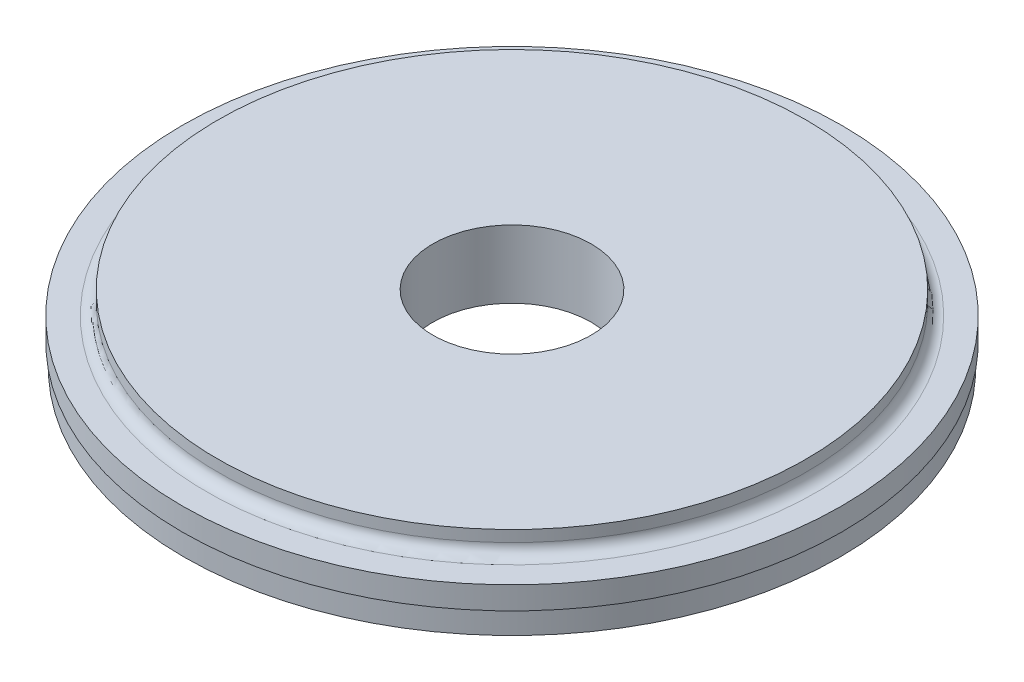
ISO-10303-21;
HEADER;
FILE_DESCRIPTION(('STEP AP214'),'2;1');
FILE_NAME('part.step','',(''),(''),'','','');
FILE_SCHEMA(('AUTOMOTIVE_DESIGN { 1 0 10303 214 1 1 1 1 }'));
ENDSEC;
DATA;
#1=APPLICATION_CONTEXT('core data for automotive mechanical design processes');
#2=APPLICATION_PROTOCOL_DEFINITION('international standard','automotive_design',2000,#1);
#3=PRODUCT_CONTEXT('',#1,'mechanical');
#4=PRODUCT('Part','Part','',(#3));
#5=PRODUCT_RELATED_PRODUCT_CATEGORY('part','',(#4));
#6=PRODUCT_DEFINITION_FORMATION('','',#4);
#7=PRODUCT_DEFINITION_CONTEXT('part definition',#1,'design');
#8=PRODUCT_DEFINITION('design','',#6,#7);
#9=PRODUCT_DEFINITION_SHAPE('','',#8);
#10=(LENGTH_UNIT() NAMED_UNIT(*) SI_UNIT(.MILLI.,.METRE.));
#11=(NAMED_UNIT(*) PLANE_ANGLE_UNIT() SI_UNIT($,.RADIAN.));
#12=(NAMED_UNIT(*) SI_UNIT($,.STERADIAN.) SOLID_ANGLE_UNIT());
#13=UNCERTAINTY_MEASURE_WITH_UNIT(LENGTH_MEASURE(1.E-05),#10,'distance_accuracy_value','');
#14=(GEOMETRIC_REPRESENTATION_CONTEXT(3) GLOBAL_UNCERTAINTY_ASSIGNED_CONTEXT((#13)) GLOBAL_UNIT_ASSIGNED_CONTEXT((#10,
#11,#12)) REPRESENTATION_CONTEXT('',''));
#15=CARTESIAN_POINT('',(0.,0.,0.));
#16=DIRECTION('',(0.,0.,1.));
#17=DIRECTION('',(1.,0.,0.));
#18=AXIS2_PLACEMENT_3D('',#15,#16,#17);
#19=CARTESIAN_POINT('',(0.,15.,65.));
#20=DIRECTION('',(0.,-1.,0.));
#21=DIRECTION('',(0.,0.,-1.));
#22=AXIS2_PLACEMENT_3D('',#19,#20,#21);
#23=PLANE('',#22);
#24=CARTESIAN_POINT('',(0.,15.,0.));
#25=DIRECTION('',(0.,-1.,0.));
#26=DIRECTION('',(0.,0.,-1.));
#27=AXIS2_PLACEMENT_3D('',#24,#25,#26);
#28=CIRCLE('',#27,65.);
#29=CARTESIAN_POINT('',(0.,15.,-65.));
#30=VERTEX_POINT('',#29);
#31=EDGE_CURVE('E10',#30,#30,#28,.T.);
#32=ORIENTED_EDGE('',*,*,#31,.F.);
#33=EDGE_LOOP('',(#32));
#34=FACE_BOUND('',#33,.T.);
#35=CARTESIAN_POINT('',(0.,15.,0.));
#36=DIRECTION('',(0.,-1.,0.));
#37=DIRECTION('',(0.,0.,-1.));
#38=AXIS2_PLACEMENT_3D('',#35,#36,#37);
#39=CIRCLE('',#38,17.5);
#40=CARTESIAN_POINT('',(0.,15.,-17.5));
#41=VERTEX_POINT('',#40);
#42=EDGE_CURVE('E78',#41,#41,#39,.T.);
#43=ORIENTED_EDGE('',*,*,#42,.T.);
#44=EDGE_LOOP('',(#43));
#45=FACE_BOUND('',#44,.T.);
#46=ADVANCED_FACE('F37',(#34,#45),#23,.F.);
#47=CARTESIAN_POINT('',(0.,0.,0.));
#48=DIRECTION('',(0.,-1.,0.));
#49=DIRECTION('',(0.,0.,-1.));
#50=AXIS2_PLACEMENT_3D('',#47,#48,#49);
#51=CYLINDRICAL_SURFACE('',#50,65.);
#52=CARTESIAN_POINT('',(0.,12.5,0.));
#53=DIRECTION('',(0.,-1.,0.));
#54=DIRECTION('',(0.,0.,-1.));
#55=AXIS2_PLACEMENT_3D('',#52,#53,#54);
#56=CIRCLE('',#55,65.);
#57=CARTESIAN_POINT('',(0.,12.5,-65.));
#58=VERTEX_POINT('',#57);
#59=EDGE_CURVE('E44',#58,#58,#56,.T.);
#60=ORIENTED_EDGE('',*,*,#59,.F.);
#61=EDGE_LOOP('',(#60));
#62=FACE_BOUND('',#61,.T.);
#63=ORIENTED_EDGE('',*,*,#31,.T.);
#64=EDGE_LOOP('',(#63));
#65=FACE_BOUND('',#64,.T.);
#66=ADVANCED_FACE('F123',(#62,#65),#51,.T.);
#67=CARTESIAN_POINT('',(0.,12.5,0.));
#68=DIRECTION('',(0.,-1.,0.));
#69=DIRECTION('',(0.,0.,-1.));
#70=AXIS2_PLACEMENT_3D('',#67,#68,#69);
#71=TOROIDAL_SURFACE('',#70,67.5,2.5);
#72=CARTESIAN_POINT('',(0.,9.99999999999999,0.));
#73=DIRECTION('',(0.,-1.,0.));
#74=DIRECTION('',(0.,0.,-1.));
#75=AXIS2_PLACEMENT_3D('',#72,#73,#74);
#76=CIRCLE('',#75,67.5);
#77=CARTESIAN_POINT('',(0.,9.99999999999999,-67.5));
#78=VERTEX_POINT('',#77);
#79=EDGE_CURVE('E50',#78,#78,#76,.T.);
#80=ORIENTED_EDGE('',*,*,#79,.F.);
#81=EDGE_LOOP('',(#80));
#82=FACE_BOUND('',#81,.T.);
#83=ORIENTED_EDGE('',*,*,#59,.T.);
#84=EDGE_LOOP('',(#83));
#85=FACE_BOUND('',#84,.T.);
#86=ADVANCED_FACE('F118',(#82,#85),#71,.F.);
#87=CARTESIAN_POINT('',(0.,9.99999999999999,72.9));
#88=DIRECTION('',(0.,-1.,0.));
#89=DIRECTION('',(0.,0.,-1.));
#90=AXIS2_PLACEMENT_3D('',#87,#88,#89);
#91=PLANE('',#90);
#92=CARTESIAN_POINT('',(0.,9.99999999999999,0.));
#93=DIRECTION('',(0.,-1.,0.));
#94=DIRECTION('',(0.,0.,-1.));
#95=AXIS2_PLACEMENT_3D('',#92,#93,#94);
#96=CIRCLE('',#95,72.9);
#97=CARTESIAN_POINT('',(0.,9.99999999999999,-72.9));
#98=VERTEX_POINT('',#97);
#99=EDGE_CURVE('E56',#98,#98,#96,.T.);
#100=ORIENTED_EDGE('',*,*,#99,.F.);
#101=EDGE_LOOP('',(#100));
#102=FACE_BOUND('',#101,.T.);
#103=ORIENTED_EDGE('',*,*,#79,.T.);
#104=EDGE_LOOP('',(#103));
#105=FACE_BOUND('',#104,.T.);
#106=ADVANCED_FACE('F112',(#102,#105),#91,.F.);
#107=CARTESIAN_POINT('',(0.,0.,0.));
#108=DIRECTION('',(0.,-1.,0.));
#109=DIRECTION('',(0.,0.,-1.));
#110=AXIS2_PLACEMENT_3D('',#107,#108,#109);
#111=CYLINDRICAL_SURFACE('',#110,72.9);
#112=CARTESIAN_POINT('',(0.,4.99999999999999,0.));
#113=DIRECTION('',(0.,-1.,0.));
#114=DIRECTION('',(0.,0.,-1.));
#115=AXIS2_PLACEMENT_3D('',#112,#113,#114);
#116=CIRCLE('',#115,72.9);
#117=CARTESIAN_POINT('',(0.,4.99999999999999,-72.9));
#118=VERTEX_POINT('',#117);
#119=EDGE_CURVE('E62',#118,#118,#116,.T.);
#120=ORIENTED_EDGE('',*,*,#119,.F.);
#121=EDGE_LOOP('',(#120));
#122=FACE_BOUND('',#121,.T.);
#123=ORIENTED_EDGE('',*,*,#99,.T.);
#124=EDGE_LOOP('',(#123));
#125=FACE_BOUND('',#124,.T.);
#126=ADVANCED_FACE('F106',(#122,#125),#111,.T.);
#127=CARTESIAN_POINT('',(0.,4.99999999999999,72.5));
#128=DIRECTION('',(0.,1.,0.));
#129=DIRECTION('',(0.,0.,1.));
#130=AXIS2_PLACEMENT_3D('',#127,#128,#129);
#131=PLANE('',#130);
#132=CARTESIAN_POINT('',(0.,4.99999999999999,0.));
#133=DIRECTION('',(0.,-1.,0.));
#134=DIRECTION('',(0.,0.,-1.));
#135=AXIS2_PLACEMENT_3D('',#132,#133,#134);
#136=CIRCLE('',#135,72.5);
#137=CARTESIAN_POINT('',(0.,4.99999999999999,-72.5));
#138=VERTEX_POINT('',#137);
#139=EDGE_CURVE('E66',#138,#138,#136,.T.);
#140=ORIENTED_EDGE('',*,*,#139,.F.);
#141=EDGE_LOOP('',(#140));
#142=FACE_BOUND('',#141,.T.);
#143=ORIENTED_EDGE('',*,*,#119,.T.);
#144=EDGE_LOOP('',(#143));
#145=FACE_BOUND('',#144,.T.);
#146=ADVANCED_FACE('F100',(#142,#145),#131,.F.);
#147=CARTESIAN_POINT('',(0.,0.,0.));
#148=DIRECTION('',(0.,-1.,0.));
#149=DIRECTION('',(0.,0.,-1.));
#150=AXIS2_PLACEMENT_3D('',#147,#148,#149);
#151=CYLINDRICAL_SURFACE('',#150,72.5);
#152=CARTESIAN_POINT('',(0.,0.,0.));
#153=DIRECTION('',(0.,-1.,0.));
#154=DIRECTION('',(0.,0.,-1.));
#155=AXIS2_PLACEMENT_3D('',#152,#153,#154);
#156=CIRCLE('',#155,72.5);
#157=CARTESIAN_POINT('',(0.,0.,-72.5));
#158=VERTEX_POINT('',#157);
#159=EDGE_CURVE('E70',#158,#158,#156,.T.);
#160=ORIENTED_EDGE('',*,*,#159,.F.);
#161=EDGE_LOOP('',(#160));
#162=FACE_BOUND('',#161,.T.);
#163=ORIENTED_EDGE('',*,*,#139,.T.);
#164=EDGE_LOOP('',(#163));
#165=FACE_BOUND('',#164,.T.);
#166=ADVANCED_FACE('F94',(#162,#165),#151,.T.);
#167=CARTESIAN_POINT('',(0.,0.,17.5));
#168=DIRECTION('',(0.,1.,0.));
#169=DIRECTION('',(0.,0.,1.));
#170=AXIS2_PLACEMENT_3D('',#167,#168,#169);
#171=PLANE('',#170);
#172=CARTESIAN_POINT('',(0.,0.,0.));
#173=DIRECTION('',(0.,-1.,0.));
#174=DIRECTION('',(0.,0.,-1.));
#175=AXIS2_PLACEMENT_3D('',#172,#173,#174);
#176=CIRCLE('',#175,17.5);
#177=CARTESIAN_POINT('',(0.,0.,-17.5));
#178=VERTEX_POINT('',#177);
#179=EDGE_CURVE('E74',#178,#178,#176,.T.);
#180=ORIENTED_EDGE('',*,*,#179,.F.);
#181=EDGE_LOOP('',(#180));
#182=FACE_BOUND('',#181,.T.);
#183=ORIENTED_EDGE('',*,*,#159,.T.);
#184=EDGE_LOOP('',(#183));
#185=FACE_BOUND('',#184,.T.);
#186=ADVANCED_FACE('F88',(#182,#185),#171,.F.);
#187=CARTESIAN_POINT('',(0.,0.,0.));
#188=DIRECTION('',(0.,-1.,0.));
#189=DIRECTION('',(0.,0.,-1.));
#190=AXIS2_PLACEMENT_3D('',#187,#188,#189);
#191=CYLINDRICAL_SURFACE('',#190,17.5);
#192=ORIENTED_EDGE('',*,*,#42,.F.);
#193=EDGE_LOOP('',(#192));
#194=FACE_BOUND('',#193,.T.);
#195=ORIENTED_EDGE('',*,*,#179,.T.);
#196=EDGE_LOOP('',(#195));
#197=FACE_BOUND('',#196,.T.);
#198=ADVANCED_FACE('F85',(#194,#197),#191,.F.);
#199=CLOSED_SHELL('',(#46,#66,#86,#106,#126,#146,#166,#186,#198));
#200=MANIFOLD_SOLID_BREP('B2',#199);
#201=ADVANCED_BREP_SHAPE_REPRESENTATION('',(#18,#200),#14);
#202=SHAPE_DEFINITION_REPRESENTATION(#9,#201);
ENDSEC;
END-ISO-10303-21;
